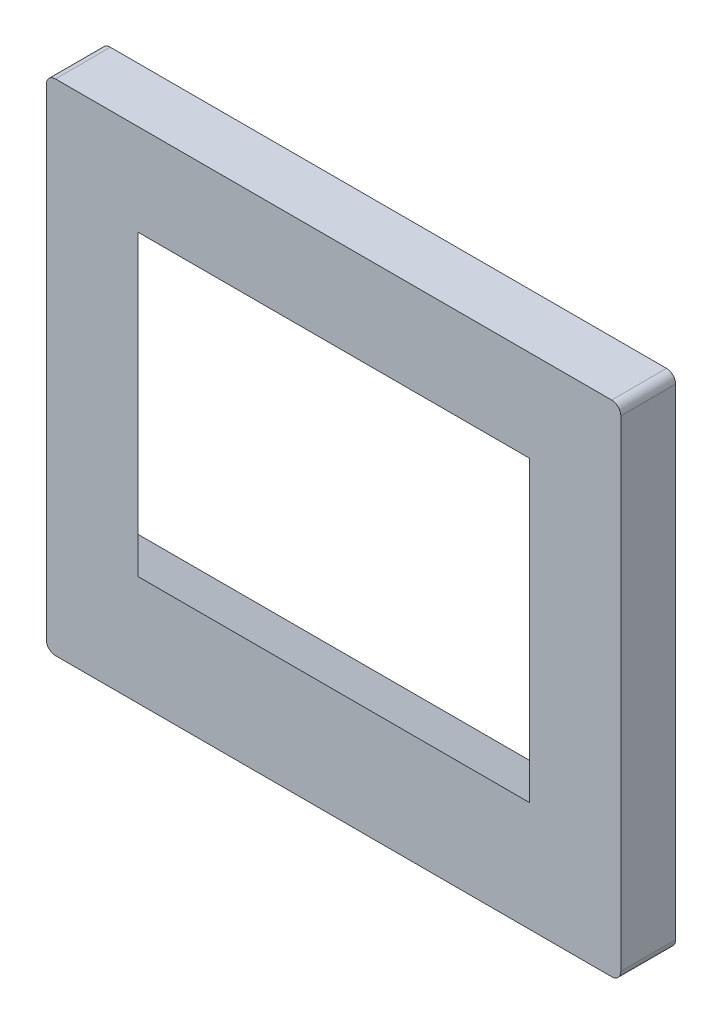
ISO-10303-21;
HEADER;
FILE_DESCRIPTION(('STEP AP214'),'2;1');
FILE_NAME('part.step','',(''),(''),'','','');
FILE_SCHEMA(('AUTOMOTIVE_DESIGN { 1 0 10303 214 1 1 1 1 }'));
ENDSEC;
DATA;
#1=APPLICATION_CONTEXT('core data for automotive mechanical design processes');
#2=APPLICATION_PROTOCOL_DEFINITION('international standard','automotive_design',2000,#1);
#3=PRODUCT_CONTEXT('',#1,'mechanical');
#4=PRODUCT('Part','Part','',(#3));
#5=PRODUCT_RELATED_PRODUCT_CATEGORY('part','',(#4));
#6=PRODUCT_DEFINITION_FORMATION('','',#4);
#7=PRODUCT_DEFINITION_CONTEXT('part definition',#1,'design');
#8=PRODUCT_DEFINITION('design','',#6,#7);
#9=PRODUCT_DEFINITION_SHAPE('','',#8);
#10=(LENGTH_UNIT() NAMED_UNIT(*) SI_UNIT(.MILLI.,.METRE.));
#11=(NAMED_UNIT(*) PLANE_ANGLE_UNIT() SI_UNIT($,.RADIAN.));
#12=(NAMED_UNIT(*) SI_UNIT($,.STERADIAN.) SOLID_ANGLE_UNIT());
#13=UNCERTAINTY_MEASURE_WITH_UNIT(LENGTH_MEASURE(1.E-05),#10,'distance_accuracy_value','');
#14=(GEOMETRIC_REPRESENTATION_CONTEXT(3) GLOBAL_UNCERTAINTY_ASSIGNED_CONTEXT((#13)) GLOBAL_UNIT_ASSIGNED_CONTEXT((#10,
#11,#12)) REPRESENTATION_CONTEXT('',''));
#15=CARTESIAN_POINT('',(0.,0.,0.));
#16=DIRECTION('',(0.,0.,1.));
#17=DIRECTION('',(1.,0.,0.));
#18=AXIS2_PLACEMENT_3D('',#15,#16,#17);
#19=CARTESIAN_POINT('',(0.,0.,-6.));
#20=DIRECTION('',(0.,0.,1.));
#21=DIRECTION('',(1.,0.,0.));
#22=AXIS2_PLACEMENT_3D('',#19,#20,#21);
#23=PLANE('',#22);
#24=DIRECTION('',(-1.,0.,0.));
#25=VECTOR('',#24,1.);
#26=CARTESIAN_POINT('',(31.4,28.66,-6.));
#27=LINE('',#26,#25);
#28=CARTESIAN_POINT('',(30.4,28.66,-6.));
#29=VERTEX_POINT('',#28);
#30=CARTESIAN_POINT('',(-30.4,28.66,-6.));
#31=VERTEX_POINT('',#30);
#32=EDGE_CURVE('E194',#29,#31,#27,.T.);
#33=ORIENTED_EDGE('',*,*,#32,.F.);
#34=CARTESIAN_POINT('',(30.4,27.66,-6.));
#35=DIRECTION('',(0.,0.,1.));
#36=DIRECTION('',(1.,0.,0.));
#37=AXIS2_PLACEMENT_3D('',#34,#35,#36);
#38=CIRCLE('',#37,1.);
#39=CARTESIAN_POINT('',(31.4,27.66,-6.));
#40=VERTEX_POINT('',#39);
#41=EDGE_CURVE('E310',#29,#40,#38,.F.);
#42=ORIENTED_EDGE('',*,*,#41,.T.);
#43=DIRECTION('',(0.,1.,0.));
#44=VECTOR('',#43,1.);
#45=CARTESIAN_POINT('',(31.4,-25.94,-6.));
#46=LINE('',#45,#44);
#47=CARTESIAN_POINT('',(31.4,-24.94,-6.));
#48=VERTEX_POINT('',#47);
#49=EDGE_CURVE('E190',#48,#40,#46,.T.);
#50=ORIENTED_EDGE('',*,*,#49,.F.);
#51=CARTESIAN_POINT('',(30.4,-24.94,-6.));
#52=DIRECTION('',(0.,0.,1.));
#53=DIRECTION('',(1.,0.,0.));
#54=AXIS2_PLACEMENT_3D('',#51,#52,#53);
#55=CIRCLE('',#54,1.);
#56=CARTESIAN_POINT('',(30.4,-25.94,-6.));
#57=VERTEX_POINT('',#56);
#58=EDGE_CURVE('E291',#48,#57,#55,.F.);
#59=ORIENTED_EDGE('',*,*,#58,.T.);
#60=DIRECTION('',(1.,0.,0.));
#61=VECTOR('',#60,1.);
#62=CARTESIAN_POINT('',(-31.4,-25.94,-6.));
#63=LINE('',#62,#61);
#64=CARTESIAN_POINT('',(-30.4,-25.94,-6.));
#65=VERTEX_POINT('',#64);
#66=EDGE_CURVE('E187',#65,#57,#63,.T.);
#67=ORIENTED_EDGE('',*,*,#66,.F.);
#68=CARTESIAN_POINT('',(-30.4,-24.94,-6.));
#69=DIRECTION('',(0.,0.,1.));
#70=DIRECTION('',(1.,0.,0.));
#71=AXIS2_PLACEMENT_3D('',#68,#69,#70);
#72=CIRCLE('',#71,1.);
#73=CARTESIAN_POINT('',(-31.4,-24.94,-6.));
#74=VERTEX_POINT('',#73);
#75=EDGE_CURVE('E60',#65,#74,#72,.F.);
#76=ORIENTED_EDGE('',*,*,#75,.T.);
#77=DIRECTION('',(0.,-1.,0.));
#78=VECTOR('',#77,1.);
#79=CARTESIAN_POINT('',(-31.4,28.66,-6.));
#80=LINE('',#79,#78);
#81=CARTESIAN_POINT('',(-31.4,27.66,-6.));
#82=VERTEX_POINT('',#81);
#83=EDGE_CURVE('E197',#82,#74,#80,.T.);
#84=ORIENTED_EDGE('',*,*,#83,.F.);
#85=CARTESIAN_POINT('',(-30.4,27.66,-6.));
#86=DIRECTION('',(0.,0.,1.));
#87=DIRECTION('',(1.,0.,0.));
#88=AXIS2_PLACEMENT_3D('',#85,#86,#87);
#89=CIRCLE('',#88,1.);
#90=EDGE_CURVE('E308',#82,#31,#89,.F.);
#91=ORIENTED_EDGE('',*,*,#90,.T.);
#92=EDGE_LOOP('',(#33,#42,#50,#59,#67,#76,#84,#91));
#93=FACE_BOUND('',#92,.T.);
#94=DIRECTION('',(0.,1.,0.));
#95=VECTOR('',#94,1.);
#96=CARTESIAN_POINT('',(-27.4,20.66,-6.));
#97=LINE('',#96,#95);
#98=CARTESIAN_POINT('',(-27.4,-15.94,-6.));
#99=VERTEX_POINT('',#98);
#100=CARTESIAN_POINT('',(-27.4,20.66,-6.));
#101=VERTEX_POINT('',#100);
#102=EDGE_CURVE('E167',#99,#101,#97,.T.);
#103=ORIENTED_EDGE('',*,*,#102,.F.);
#104=DIRECTION('',(-1.,0.,0.));
#105=VECTOR('',#104,1.);
#106=CARTESIAN_POINT('',(-27.4,-15.94,-6.));
#107=LINE('',#106,#105);
#108=CARTESIAN_POINT('',(27.4,-15.94,-6.));
#109=VERTEX_POINT('',#108);
#110=EDGE_CURVE('E151',#109,#99,#107,.T.);
#111=ORIENTED_EDGE('',*,*,#110,.F.);
#112=DIRECTION('',(0.,-1.,0.));
#113=VECTOR('',#112,1.);
#114=CARTESIAN_POINT('',(27.4,-15.94,-6.));
#115=LINE('',#114,#113);
#116=CARTESIAN_POINT('',(27.4,20.66,-6.));
#117=VERTEX_POINT('',#116);
#118=EDGE_CURVE('E136',#117,#109,#115,.T.);
#119=ORIENTED_EDGE('',*,*,#118,.F.);
#120=DIRECTION('',(1.,0.,0.));
#121=VECTOR('',#120,1.);
#122=CARTESIAN_POINT('',(27.4,20.66,-6.));
#123=LINE('',#122,#121);
#124=EDGE_CURVE('E172',#101,#117,#123,.T.);
#125=ORIENTED_EDGE('',*,*,#124,.F.);
#126=EDGE_LOOP('',(#103,#111,#119,#125));
#127=FACE_BOUND('',#126,.T.);
#128=ADVANCED_FACE('F45',(#93,#127),#23,.F.);
#129=CARTESIAN_POINT('',(-31.4,-25.94,-6.));
#130=DIRECTION('',(0.,-1.,0.));
#131=DIRECTION('',(1.,0.,0.));
#132=AXIS2_PLACEMENT_3D('',#129,#130,#131);
#133=PLANE('',#132);
#134=DIRECTION('',(1.,0.,0.));
#135=VECTOR('',#134,1.);
#136=CARTESIAN_POINT('',(-31.4,-25.94,0.));
#137=LINE('',#136,#135);
#138=CARTESIAN_POINT('',(-30.4,-25.94,0.));
#139=VERTEX_POINT('',#138);
#140=CARTESIAN_POINT('',(30.4,-25.94,0.));
#141=VERTEX_POINT('',#140);
#142=EDGE_CURVE('E200',#139,#141,#137,.T.);
#143=ORIENTED_EDGE('',*,*,#142,.F.);
#144=DIRECTION('',(0.,0.,1.));
#145=VECTOR('',#144,1.);
#146=CARTESIAN_POINT('',(-30.4,-25.94,-6.));
#147=LINE('',#146,#145);
#148=EDGE_CURVE('E12',#139,#65,#147,.F.);
#149=ORIENTED_EDGE('',*,*,#148,.T.);
#150=ORIENTED_EDGE('',*,*,#66,.T.);
#151=DIRECTION('',(0.,0.,1.));
#152=VECTOR('',#151,1.);
#153=CARTESIAN_POINT('',(30.4,-25.94,-6.));
#154=LINE('',#153,#152);
#155=EDGE_CURVE('E53',#57,#141,#154,.T.);
#156=ORIENTED_EDGE('',*,*,#155,.T.);
#157=EDGE_LOOP('',(#143,#149,#150,#156));
#158=FACE_BOUND('',#157,.T.);
#159=ADVANCED_FACE('F225',(#158),#133,.T.);
#160=CARTESIAN_POINT('',(-31.4,28.66,-6.));
#161=DIRECTION('',(-1.,0.,0.));
#162=DIRECTION('',(0.,-1.,0.));
#163=AXIS2_PLACEMENT_3D('',#160,#161,#162);
#164=PLANE('',#163);
#165=DIRECTION('',(0.,-1.,0.));
#166=VECTOR('',#165,1.);
#167=CARTESIAN_POINT('',(-31.4,28.66,0.));
#168=LINE('',#167,#166);
#169=CARTESIAN_POINT('',(-31.4,27.66,0.));
#170=VERTEX_POINT('',#169);
#171=CARTESIAN_POINT('',(-31.4,-24.94,0.));
#172=VERTEX_POINT('',#171);
#173=EDGE_CURVE('E191',#170,#172,#168,.T.);
#174=ORIENTED_EDGE('',*,*,#173,.F.);
#175=DIRECTION('',(0.,0.,1.));
#176=VECTOR('',#175,1.);
#177=CARTESIAN_POINT('',(-31.4,27.66,-6.));
#178=LINE('',#177,#176);
#179=EDGE_CURVE('E67',#170,#82,#178,.F.);
#180=ORIENTED_EDGE('',*,*,#179,.T.);
#181=ORIENTED_EDGE('',*,*,#83,.T.);
#182=DIRECTION('',(0.,0.,1.));
#183=VECTOR('',#182,1.);
#184=CARTESIAN_POINT('',(-31.4,-24.94,-6.));
#185=LINE('',#184,#183);
#186=EDGE_CURVE('E312',#74,#172,#185,.T.);
#187=ORIENTED_EDGE('',*,*,#186,.T.);
#188=EDGE_LOOP('',(#174,#180,#181,#187));
#189=FACE_BOUND('',#188,.T.);
#190=ADVANCED_FACE('F321',(#189),#164,.T.);
#191=CARTESIAN_POINT('',(31.4,28.66,-6.));
#192=DIRECTION('',(0.,1.,0.));
#193=DIRECTION('',(-1.,0.,0.));
#194=AXIS2_PLACEMENT_3D('',#191,#192,#193);
#195=PLANE('',#194);
#196=DIRECTION('',(-1.,0.,0.));
#197=VECTOR('',#196,1.);
#198=CARTESIAN_POINT('',(31.4,28.66,0.));
#199=LINE('',#198,#197);
#200=CARTESIAN_POINT('',(30.4,28.66,0.));
#201=VERTEX_POINT('',#200);
#202=CARTESIAN_POINT('',(-30.4,28.66,0.));
#203=VERTEX_POINT('',#202);
#204=EDGE_CURVE('E207',#201,#203,#199,.T.);
#205=ORIENTED_EDGE('',*,*,#204,.F.);
#206=DIRECTION('',(0.,0.,1.));
#207=VECTOR('',#206,1.);
#208=CARTESIAN_POINT('',(30.4,28.66,-6.));
#209=LINE('',#208,#207);
#210=EDGE_CURVE('E304',#201,#29,#209,.F.);
#211=ORIENTED_EDGE('',*,*,#210,.T.);
#212=ORIENTED_EDGE('',*,*,#32,.T.);
#213=DIRECTION('',(0.,0.,1.));
#214=VECTOR('',#213,1.);
#215=CARTESIAN_POINT('',(-30.4,28.66,-6.));
#216=LINE('',#215,#214);
#217=EDGE_CURVE('E301',#31,#203,#216,.T.);
#218=ORIENTED_EDGE('',*,*,#217,.T.);
#219=EDGE_LOOP('',(#205,#211,#212,#218));
#220=FACE_BOUND('',#219,.T.);
#221=ADVANCED_FACE('F328',(#220),#195,.T.);
#222=CARTESIAN_POINT('',(31.4,-25.94,-6.));
#223=DIRECTION('',(1.,0.,0.));
#224=DIRECTION('',(0.,1.,0.));
#225=AXIS2_PLACEMENT_3D('',#222,#223,#224);
#226=PLANE('',#225);
#227=ORIENTED_EDGE('',*,*,#49,.T.);
#228=DIRECTION('',(0.,0.,1.));
#229=VECTOR('',#228,1.);
#230=CARTESIAN_POINT('',(31.4,27.66,-6.));
#231=LINE('',#230,#229);
#232=CARTESIAN_POINT('',(31.4,27.66,0.));
#233=VERTEX_POINT('',#232);
#234=EDGE_CURVE('E286',#40,#233,#231,.T.);
#235=ORIENTED_EDGE('',*,*,#234,.T.);
#236=DIRECTION('',(0.,1.,0.));
#237=VECTOR('',#236,1.);
#238=CARTESIAN_POINT('',(31.4,-25.94,0.));
#239=LINE('',#238,#237);
#240=CARTESIAN_POINT('',(31.4,-24.94,0.));
#241=VERTEX_POINT('',#240);
#242=EDGE_CURVE('E203',#241,#233,#239,.T.);
#243=ORIENTED_EDGE('',*,*,#242,.F.);
#244=DIRECTION('',(0.,0.,1.));
#245=VECTOR('',#244,1.);
#246=CARTESIAN_POINT('',(31.4,-24.94,-6.));
#247=LINE('',#246,#245);
#248=EDGE_CURVE('E199',#241,#48,#247,.F.);
#249=ORIENTED_EDGE('',*,*,#248,.T.);
#250=EDGE_LOOP('',(#227,#235,#243,#249));
#251=FACE_BOUND('',#250,.T.);
#252=ADVANCED_FACE('F276',(#251),#226,.T.);
#253=CARTESIAN_POINT('',(0.,0.,0.));
#254=DIRECTION('',(0.,0.,1.));
#255=DIRECTION('',(1.,0.,0.));
#256=AXIS2_PLACEMENT_3D('',#253,#254,#255);
#257=PLANE('',#256);
#258=DIRECTION('',(1.,0.,0.));
#259=VECTOR('',#258,1.);
#260=CARTESIAN_POINT('',(0.,18.66,0.));
#261=LINE('',#260,#259);
#262=CARTESIAN_POINT('',(21.4,18.66,0.));
#263=VERTEX_POINT('',#262);
#264=CARTESIAN_POINT('',(-21.4,18.66,0.));
#265=VERTEX_POINT('',#264);
#266=EDGE_CURVE('E265',#263,#265,#261,.F.);
#267=ORIENTED_EDGE('',*,*,#266,.F.);
#268=CARTESIAN_POINT('',(21.4,-13.94,0.));
#269=DIRECTION('',(0.,1.,0.));
#270=VECTOR('',#269,1.);
#271=LINE('',#268,#270);
#272=CARTESIAN_POINT('',(21.4,-13.94,0.));
#273=VERTEX_POINT('',#272);
#274=EDGE_CURVE('E204',#273,#263,#271,.T.);
#275=ORIENTED_EDGE('',*,*,#274,.F.);
#276=DIRECTION('',(1.,0.,0.));
#277=VECTOR('',#276,1.);
#278=CARTESIAN_POINT('',(0.,-13.94,0.));
#279=LINE('',#278,#277);
#280=CARTESIAN_POINT('',(-21.4,-13.94,0.));
#281=VERTEX_POINT('',#280);
#282=EDGE_CURVE('E160',#281,#273,#279,.T.);
#283=ORIENTED_EDGE('',*,*,#282,.F.);
#284=CARTESIAN_POINT('',(-21.4,18.66,0.));
#285=DIRECTION('',(0.,-1.,0.));
#286=VECTOR('',#285,1.);
#287=LINE('',#284,#286);
#288=EDGE_CURVE('E245',#265,#281,#287,.T.);
#289=ORIENTED_EDGE('',*,*,#288,.F.);
#290=EDGE_LOOP('',(#267,#275,#283,#289));
#291=FACE_BOUND('',#290,.T.);
#292=ORIENTED_EDGE('',*,*,#242,.T.);
#293=CARTESIAN_POINT('',(30.4,27.66,0.));
#294=DIRECTION('',(0.,0.,1.));
#295=DIRECTION('',(1.,0.,0.));
#296=AXIS2_PLACEMENT_3D('',#293,#294,#295);
#297=CIRCLE('',#296,1.);
#298=EDGE_CURVE('E278',#233,#201,#297,.T.);
#299=ORIENTED_EDGE('',*,*,#298,.T.);
#300=ORIENTED_EDGE('',*,*,#204,.T.);
#301=CARTESIAN_POINT('',(-30.4,27.66,0.));
#302=DIRECTION('',(0.,0.,1.));
#303=DIRECTION('',(1.,0.,0.));
#304=AXIS2_PLACEMENT_3D('',#301,#302,#303);
#305=CIRCLE('',#304,1.);
#306=EDGE_CURVE('E298',#203,#170,#305,.T.);
#307=ORIENTED_EDGE('',*,*,#306,.T.);
#308=ORIENTED_EDGE('',*,*,#173,.T.);
#309=CARTESIAN_POINT('',(-30.4,-24.94,0.));
#310=DIRECTION('',(0.,0.,1.));
#311=DIRECTION('',(1.,0.,0.));
#312=AXIS2_PLACEMENT_3D('',#309,#310,#311);
#313=CIRCLE('',#312,1.);
#314=EDGE_CURVE('E296',#172,#139,#313,.T.);
#315=ORIENTED_EDGE('',*,*,#314,.T.);
#316=ORIENTED_EDGE('',*,*,#142,.T.);
#317=CARTESIAN_POINT('',(30.4,-24.94,0.));
#318=DIRECTION('',(0.,0.,1.));
#319=DIRECTION('',(1.,0.,0.));
#320=AXIS2_PLACEMENT_3D('',#317,#318,#319);
#321=CIRCLE('',#320,1.);
#322=EDGE_CURVE('E280',#141,#241,#321,.T.);
#323=ORIENTED_EDGE('',*,*,#322,.T.);
#324=EDGE_LOOP('',(#292,#299,#300,#307,#308,#315,#316,#323));
#325=FACE_BOUND('',#324,.T.);
#326=ADVANCED_FACE('F228',(#291,#325),#257,.T.);
#327=CARTESIAN_POINT('',(-10.7,0.,10.7));
#328=DIRECTION('',(0.707106781186548,0.,-0.707106781186547));
#329=DIRECTION('',(-0.707106781186547,0.,-0.707106781186548));
#330=AXIS2_PLACEMENT_3D('',#327,#328,#329);
#331=PLANE('',#330);
#332=CARTESIAN_POINT('',(-27.4,-15.94,-6.));
#333=DIRECTION('',(0.688247201611685,0.229415733870562,0.688247201611686));
#334=VECTOR('',#333,1.);
#335=LINE('',#332,#334);
#336=EDGE_CURVE('E150',#99,#281,#335,.T.);
#337=ORIENTED_EDGE('',*,*,#336,.F.);
#338=ORIENTED_EDGE('',*,*,#102,.T.);
#339=CARTESIAN_POINT('',(-27.4,20.66,-6.00000000000001));
#340=DIRECTION('',(0.688247201611685,-0.229415733870561,0.688247201611686));
#341=VECTOR('',#340,1.);
#342=LINE('',#339,#341);
#343=EDGE_CURVE('E163',#101,#265,#342,.T.);
#344=ORIENTED_EDGE('',*,*,#343,.T.);
#345=ORIENTED_EDGE('',*,*,#288,.T.);
#346=EDGE_LOOP('',(#337,#338,#344,#345));
#347=FACE_BOUND('',#346,.T.);
#348=ADVANCED_FACE('F275',(#347),#331,.T.);
#349=CARTESIAN_POINT('',(0.,16.794,5.59799999999999));
#350=DIRECTION('',(0.,-0.948683298050514,-0.316227766016838));
#351=DIRECTION('',(0.,0.316227766016838,-0.948683298050514));
#352=AXIS2_PLACEMENT_3D('',#349,#350,#351);
#353=PLANE('',#352);
#354=ORIENTED_EDGE('',*,*,#343,.F.);
#355=ORIENTED_EDGE('',*,*,#124,.T.);
#356=CARTESIAN_POINT('',(27.4,20.66,-6.));
#357=DIRECTION('',(-0.688247201611686,-0.229415733870562,0.688247201611685));
#358=VECTOR('',#357,1.);
#359=LINE('',#356,#358);
#360=EDGE_CURVE('E144',#117,#263,#359,.T.);
#361=ORIENTED_EDGE('',*,*,#360,.T.);
#362=ORIENTED_EDGE('',*,*,#266,.T.);
#363=EDGE_LOOP('',(#354,#355,#361,#362));
#364=FACE_BOUND('',#363,.T.);
#365=ADVANCED_FACE('F270',(#364),#353,.T.);
#366=CARTESIAN_POINT('',(0.,-12.546,4.182));
#367=DIRECTION('',(0.,0.948683298050514,-0.316227766016838));
#368=DIRECTION('',(0.,0.316227766016838,0.948683298050514));
#369=AXIS2_PLACEMENT_3D('',#366,#367,#368);
#370=PLANE('',#369);
#371=CARTESIAN_POINT('',(27.4,-15.94,-6.));
#372=DIRECTION('',(-0.688247201611686,0.229415733870561,0.688247201611685));
#373=VECTOR('',#372,1.);
#374=LINE('',#371,#373);
#375=EDGE_CURVE('E140',#109,#273,#374,.T.);
#376=ORIENTED_EDGE('',*,*,#375,.F.);
#377=ORIENTED_EDGE('',*,*,#110,.T.);
#378=ORIENTED_EDGE('',*,*,#336,.T.);
#379=ORIENTED_EDGE('',*,*,#282,.T.);
#380=EDGE_LOOP('',(#376,#377,#378,#379));
#381=FACE_BOUND('',#380,.T.);
#382=ADVANCED_FACE('F157',(#381),#370,.T.);
#383=CARTESIAN_POINT('',(10.7,0.,10.7));
#384=DIRECTION('',(-0.707106781186547,0.,-0.707106781186548));
#385=DIRECTION('',(-0.707106781186548,0.,0.707106781186547));
#386=AXIS2_PLACEMENT_3D('',#383,#384,#385);
#387=PLANE('',#386);
#388=ORIENTED_EDGE('',*,*,#360,.F.);
#389=ORIENTED_EDGE('',*,*,#118,.T.);
#390=ORIENTED_EDGE('',*,*,#375,.T.);
#391=ORIENTED_EDGE('',*,*,#274,.T.);
#392=EDGE_LOOP('',(#388,#389,#390,#391));
#393=FACE_BOUND('',#392,.T.);
#394=ADVANCED_FACE('F139',(#393),#387,.T.);
#395=CARTESIAN_POINT('',(30.4,27.66,-6.));
#396=DIRECTION('',(0.,0.,1.));
#397=DIRECTION('',(1.,0.,0.));
#398=AXIS2_PLACEMENT_3D('',#395,#396,#397);
#399=CYLINDRICAL_SURFACE('',#398,1.);
#400=ORIENTED_EDGE('',*,*,#41,.F.);
#401=ORIENTED_EDGE('',*,*,#210,.F.);
#402=ORIENTED_EDGE('',*,*,#298,.F.);
#403=ORIENTED_EDGE('',*,*,#234,.F.);
#404=EDGE_LOOP('',(#400,#401,#402,#403));
#405=FACE_BOUND('',#404,.T.);
#406=ADVANCED_FACE('F332',(#405),#399,.T.);
#407=CARTESIAN_POINT('',(-30.4,27.66,-6.));
#408=DIRECTION('',(0.,0.,1.));
#409=DIRECTION('',(1.,0.,0.));
#410=AXIS2_PLACEMENT_3D('',#407,#408,#409);
#411=CYLINDRICAL_SURFACE('',#410,1.);
#412=ORIENTED_EDGE('',*,*,#90,.F.);
#413=ORIENTED_EDGE('',*,*,#179,.F.);
#414=ORIENTED_EDGE('',*,*,#306,.F.);
#415=ORIENTED_EDGE('',*,*,#217,.F.);
#416=EDGE_LOOP('',(#412,#413,#414,#415));
#417=FACE_BOUND('',#416,.T.);
#418=ADVANCED_FACE('F326',(#417),#411,.T.);
#419=CARTESIAN_POINT('',(-30.4,-24.94,-6.));
#420=DIRECTION('',(0.,0.,1.));
#421=DIRECTION('',(1.,0.,0.));
#422=AXIS2_PLACEMENT_3D('',#419,#420,#421);
#423=CYLINDRICAL_SURFACE('',#422,1.);
#424=ORIENTED_EDGE('',*,*,#75,.F.);
#425=ORIENTED_EDGE('',*,*,#148,.F.);
#426=ORIENTED_EDGE('',*,*,#314,.F.);
#427=ORIENTED_EDGE('',*,*,#186,.F.);
#428=EDGE_LOOP('',(#424,#425,#426,#427));
#429=FACE_BOUND('',#428,.T.);
#430=ADVANCED_FACE('F320',(#429),#423,.T.);
#431=CARTESIAN_POINT('',(30.4,-24.94,-6.));
#432=DIRECTION('',(0.,0.,1.));
#433=DIRECTION('',(1.,0.,0.));
#434=AXIS2_PLACEMENT_3D('',#431,#432,#433);
#435=CYLINDRICAL_SURFACE('',#434,1.);
#436=ORIENTED_EDGE('',*,*,#58,.F.);
#437=ORIENTED_EDGE('',*,*,#248,.F.);
#438=ORIENTED_EDGE('',*,*,#322,.F.);
#439=ORIENTED_EDGE('',*,*,#155,.F.);
#440=EDGE_LOOP('',(#436,#437,#438,#439));
#441=FACE_BOUND('',#440,.T.);
#442=ADVANCED_FACE('F47',(#441),#435,.T.);
#443=CLOSED_SHELL('',(#128,#159,#190,#221,#252,#326,#348,#365,#382,#394,#406,#418,#430,#442));
#444=MANIFOLD_SOLID_BREP('B2',#443);
#445=ADVANCED_BREP_SHAPE_REPRESENTATION('',(#18,#444),#14);
#446=SHAPE_DEFINITION_REPRESENTATION(#9,#445);
ENDSEC;
END-ISO-10303-21;
